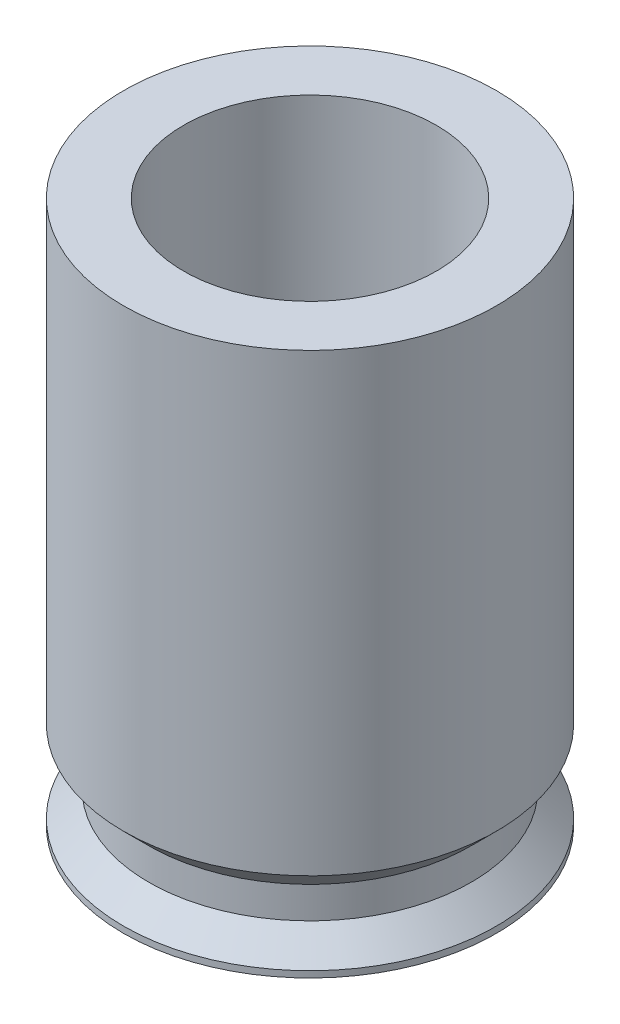
ISO-10303-21;
HEADER;
FILE_DESCRIPTION(('STEP AP214'),'2;1');
FILE_NAME('part.step','',(''),(''),'','','');
FILE_SCHEMA(('AUTOMOTIVE_DESIGN { 1 0 10303 214 1 1 1 1 }'));
ENDSEC;
DATA;
#1=APPLICATION_CONTEXT('core data for automotive mechanical design processes');
#2=APPLICATION_PROTOCOL_DEFINITION('international standard','automotive_design',2000,#1);
#3=PRODUCT_CONTEXT('',#1,'mechanical');
#4=PRODUCT('Part','Part','',(#3));
#5=PRODUCT_RELATED_PRODUCT_CATEGORY('part','',(#4));
#6=PRODUCT_DEFINITION_FORMATION('','',#4);
#7=PRODUCT_DEFINITION_CONTEXT('part definition',#1,'design');
#8=PRODUCT_DEFINITION('design','',#6,#7);
#9=PRODUCT_DEFINITION_SHAPE('','',#8);
#10=(LENGTH_UNIT() NAMED_UNIT(*) SI_UNIT(.MILLI.,.METRE.));
#11=(NAMED_UNIT(*) PLANE_ANGLE_UNIT() SI_UNIT($,.RADIAN.));
#12=(NAMED_UNIT(*) SI_UNIT($,.STERADIAN.) SOLID_ANGLE_UNIT());
#13=UNCERTAINTY_MEASURE_WITH_UNIT(LENGTH_MEASURE(1.E-05),#10,'distance_accuracy_value','');
#14=(GEOMETRIC_REPRESENTATION_CONTEXT(3) GLOBAL_UNCERTAINTY_ASSIGNED_CONTEXT((#13)) GLOBAL_UNIT_ASSIGNED_CONTEXT((#10,
#11,#12)) REPRESENTATION_CONTEXT('',''));
#15=CARTESIAN_POINT('',(0.,0.,0.));
#16=DIRECTION('',(0.,0.,1.));
#17=DIRECTION('',(1.,0.,0.));
#18=AXIS2_PLACEMENT_3D('',#15,#16,#17);
#19=CARTESIAN_POINT('',(0.,4.3,0.));
#20=DIRECTION('',(0.,-1.,0.));
#21=DIRECTION('',(0.,0.,-1.));
#22=AXIS2_PLACEMENT_3D('',#19,#20,#21);
#23=CYLINDRICAL_SURFACE('',#22,2.95);
#24=CARTESIAN_POINT('',(0.,-4.2,0.));
#25=DIRECTION('',(0.,1.,0.));
#26=DIRECTION('',(0.,0.,1.));
#27=AXIS2_PLACEMENT_3D('',#24,#25,#26);
#28=CIRCLE('',#27,2.95);
#29=CARTESIAN_POINT('',(0.,-4.2,-2.95));
#30=VERTEX_POINT('',#29);
#31=EDGE_CURVE('E40',#30,#30,#28,.F.);
#32=CARTESIAN_POINT('',(0.,-4.3,0.));
#33=DIRECTION('',(0.,1.,0.));
#34=DIRECTION('',(0.,0.,1.));
#35=AXIS2_PLACEMENT_3D('',#32,#33,#34);
#36=CIRCLE('',#35,2.95);
#37=CARTESIAN_POINT('',(0.,-4.3,-2.95));
#38=VERTEX_POINT('',#37);
#39=EDGE_CURVE('E48',#38,#38,#36,.T.);
#40=CARTESIAN_POINT('',(0.,-4.2,-2.95));
#41=CARTESIAN_POINT('',(0.,-4.20104166666667,-2.95));
#42=CARTESIAN_POINT('',(0.,-4.20208333333333,-2.95));
#43=CARTESIAN_POINT('',(0.,-4.20416666666666,-2.95));
#44=CARTESIAN_POINT('',(0.,-4.20520833333333,-2.95));
#45=CARTESIAN_POINT('',(0.,-4.20729166666667,-2.95));
#46=CARTESIAN_POINT('',(0.,-4.20833333333333,-2.95));
#47=CARTESIAN_POINT('',(0.,-4.21041666666667,-2.95));
#48=CARTESIAN_POINT('',(0.,-4.21145833333333,-2.95));
#49=CARTESIAN_POINT('',(0.,-4.21354166666667,-2.95));
#50=CARTESIAN_POINT('',(0.,-4.21458333333333,-2.95));
#51=CARTESIAN_POINT('',(0.,-4.21666666666667,-2.95));
#52=CARTESIAN_POINT('',(0.,-4.21770833333333,-2.95));
#53=CARTESIAN_POINT('',(0.,-4.21979166666667,-2.95));
#54=CARTESIAN_POINT('',(0.,-4.22083333333333,-2.95));
#55=CARTESIAN_POINT('',(0.,-4.22291666666667,-2.95));
#56=CARTESIAN_POINT('',(0.,-4.22395833333333,-2.95));
#57=CARTESIAN_POINT('',(0.,-4.22604166666667,-2.95));
#58=CARTESIAN_POINT('',(0.,-4.22708333333333,-2.95));
#59=CARTESIAN_POINT('',(0.,-4.22916666666667,-2.95));
#60=CARTESIAN_POINT('',(0.,-4.23020833333333,-2.95));
#61=CARTESIAN_POINT('',(0.,-4.23229166666667,-2.95));
#62=CARTESIAN_POINT('',(0.,-4.23333333333333,-2.95));
#63=CARTESIAN_POINT('',(0.,-4.23541666666667,-2.95));
#64=CARTESIAN_POINT('',(0.,-4.23645833333333,-2.95));
#65=CARTESIAN_POINT('',(0.,-4.23854166666667,-2.95));
#66=CARTESIAN_POINT('',(0.,-4.23958333333333,-2.95));
#67=CARTESIAN_POINT('',(0.,-4.24166666666667,-2.95));
#68=CARTESIAN_POINT('',(0.,-4.24270833333333,-2.95));
#69=CARTESIAN_POINT('',(0.,-4.24479166666667,-2.95));
#70=CARTESIAN_POINT('',(0.,-4.24583333333333,-2.95));
#71=CARTESIAN_POINT('',(0.,-4.24791666666667,-2.95));
#72=CARTESIAN_POINT('',(0.,-4.24895833333333,-2.95));
#73=CARTESIAN_POINT('',(0.,-4.25104166666667,-2.95));
#74=CARTESIAN_POINT('',(0.,-4.25208333333333,-2.95));
#75=CARTESIAN_POINT('',(0.,-4.25416666666667,-2.95));
#76=CARTESIAN_POINT('',(0.,-4.25520833333333,-2.95));
#77=CARTESIAN_POINT('',(0.,-4.25729166666667,-2.95));
#78=CARTESIAN_POINT('',(0.,-4.25833333333333,-2.95));
#79=CARTESIAN_POINT('',(0.,-4.26041666666667,-2.95));
#80=CARTESIAN_POINT('',(0.,-4.26145833333333,-2.95));
#81=CARTESIAN_POINT('',(0.,-4.26354166666667,-2.95));
#82=CARTESIAN_POINT('',(0.,-4.26458333333333,-2.95));
#83=CARTESIAN_POINT('',(0.,-4.26666666666667,-2.95));
#84=CARTESIAN_POINT('',(0.,-4.26770833333333,-2.95));
#85=CARTESIAN_POINT('',(0.,-4.26979166666667,-2.95));
#86=CARTESIAN_POINT('',(0.,-4.27083333333333,-2.95));
#87=CARTESIAN_POINT('',(0.,-4.27291666666667,-2.95));
#88=CARTESIAN_POINT('',(0.,-4.27395833333333,-2.95));
#89=CARTESIAN_POINT('',(0.,-4.27604166666667,-2.95));
#90=CARTESIAN_POINT('',(0.,-4.27708333333333,-2.95));
#91=CARTESIAN_POINT('',(0.,-4.27916666666667,-2.95));
#92=CARTESIAN_POINT('',(0.,-4.28020833333333,-2.95));
#93=CARTESIAN_POINT('',(0.,-4.28229166666667,-2.95));
#94=CARTESIAN_POINT('',(0.,-4.28333333333333,-2.95));
#95=CARTESIAN_POINT('',(0.,-4.28541666666667,-2.95));
#96=CARTESIAN_POINT('',(0.,-4.28645833333333,-2.95));
#97=CARTESIAN_POINT('',(0.,-4.28854166666667,-2.95));
#98=CARTESIAN_POINT('',(0.,-4.28958333333333,-2.95));
#99=CARTESIAN_POINT('',(0.,-4.29166666666667,-2.95));
#100=CARTESIAN_POINT('',(0.,-4.29270833333334,-2.95));
#101=CARTESIAN_POINT('',(0.,-4.29479166666667,-2.95));
#102=CARTESIAN_POINT('',(0.,-4.29583333333334,-2.95));
#103=CARTESIAN_POINT('',(0.,-4.29791666666667,-2.95));
#104=CARTESIAN_POINT('',(0.,-4.29895833333333,-2.95));
#105=CARTESIAN_POINT('',(0.,-4.3,-2.95));
#106=B_SPLINE_CURVE_WITH_KNOTS('',3,(#40,#41,#42,#43,#44,#45,#46,#47,#48,#49,#50,#51,#52,#53,
#54,#55,#56,#57,#58,#59,#60,#61,#62,#63,#64,#65,#66,#67,#68,#69,#70,#71,#72,#73,#74,#75,#76,#77,
#78,#79,#80,#81,#82,#83,#84,#85,#86,#87,#88,#89,#90,#91,#92,#93,#94,#95,#96,#97,#98,#99,#100,
#101,#102,#103,#104,#105),.UNSPECIFIED.,.F.,.F.,(4,2,2,2,2,2,2,2,2,2,2,2,2,2,2,2,2,2,2,2,2,2,2,
2,2,2,2,2,2,2,2,2,4),(0.,0.00312499999999966,0.00624999999999931,0.0093750000000007,
0.0125000000000004,0.015625,0.0187500000000014,0.0218750000000011,0.0250000000000007,
0.0281250000000004,0.03125,0.0343750000000014,0.0375000000000011,0.0406250000000007,
0.0437500000000021,0.0468750000000018,0.0500000000000014,0.0531250000000011,0.0562500000000007,
0.0593750000000021,0.0625000000000018,0.0656250000000014,0.0687500000000028,0.0718750000000025,
0.0750000000000021,0.0781250000000018,0.0812500000000015,0.0843750000000029,0.0875000000000025,
0.0906250000000022,0.0937500000000036,0.0968750000000032,0.100000000000003),.UNSPECIFIED.);
#107=EDGE_CURVE('BSEAM33',#30,#38,#106,.T.);
#108=ORIENTED_EDGE('',*,*,#31,.T.);
#109=ORIENTED_EDGE('',*,*,#39,.T.);
#110=ORIENTED_EDGE('',*,*,#107,.T.);
#111=ORIENTED_EDGE('',*,*,#107,.F.);
#112=EDGE_LOOP('',(#108,#110,#109,#111));
#113=FACE_BOUND('',#112,.T.);
#114=ADVANCED_FACE('F33',(#113),#23,.T.);
#115=CARTESIAN_POINT('',(0.,-2.89999999999997,0.));
#116=DIRECTION('',(0.,-1.,0.));
#117=DIRECTION('',(0.,0.,-1.));
#118=AXIS2_PLACEMENT_3D('',#115,#116,#117);
#119=CIRCLE('',#118,2.95);
#120=CARTESIAN_POINT('',(0.,-2.89999999999997,-2.95));
#121=VERTEX_POINT('',#120);
#122=EDGE_CURVE('E10',#121,#121,#119,.F.);
#123=CARTESIAN_POINT('',(0.,4.3,0.));
#124=DIRECTION('',(0.,1.,0.));
#125=DIRECTION('',(0.,0.,1.));
#126=AXIS2_PLACEMENT_3D('',#123,#124,#125);
#127=CIRCLE('',#126,2.95);
#128=CARTESIAN_POINT('',(0.,4.3,-2.95));
#129=VERTEX_POINT('',#128);
#130=EDGE_CURVE('E44',#129,#129,#127,.T.);
#131=CARTESIAN_POINT('',(0.,-2.89999999999997,-2.95));
#132=CARTESIAN_POINT('',(0.,-2.82499999999997,-2.95));
#133=CARTESIAN_POINT('',(0.,-2.74999999999997,-2.95));
#134=CARTESIAN_POINT('',(0.,-2.59999999999997,-2.95));
#135=CARTESIAN_POINT('',(0.,-2.52499999999997,-2.95));
#136=CARTESIAN_POINT('',(0.,-2.37499999999997,-2.95));
#137=CARTESIAN_POINT('',(0.,-2.29999999999997,-2.95));
#138=CARTESIAN_POINT('',(0.,-2.14999999999997,-2.95));
#139=CARTESIAN_POINT('',(0.,-2.07499999999997,-2.95));
#140=CARTESIAN_POINT('',(0.,-1.92499999999997,-2.95));
#141=CARTESIAN_POINT('',(0.,-1.84999999999997,-2.95));
#142=CARTESIAN_POINT('',(0.,-1.69999999999997,-2.95));
#143=CARTESIAN_POINT('',(0.,-1.62499999999997,-2.95));
#144=CARTESIAN_POINT('',(0.,-1.47499999999997,-2.95));
#145=CARTESIAN_POINT('',(0.,-1.39999999999997,-2.95));
#146=CARTESIAN_POINT('',(0.,-1.24999999999998,-2.95));
#147=CARTESIAN_POINT('',(0.,-1.17499999999998,-2.95));
#148=CARTESIAN_POINT('',(0.,-1.02499999999998,-2.95));
#149=CARTESIAN_POINT('',(0.,-0.949999999999977,-2.95));
#150=CARTESIAN_POINT('',(0.,-0.799999999999978,-2.95));
#151=CARTESIAN_POINT('',(0.,-0.724999999999978,-2.95));
#152=CARTESIAN_POINT('',(0.,-0.574999999999978,-2.95));
#153=CARTESIAN_POINT('',(0.,-0.499999999999978,-2.95));
#154=CARTESIAN_POINT('',(0.,-0.349999999999979,-2.95));
#155=CARTESIAN_POINT('',(0.,-0.274999999999979,-2.95));
#156=CARTESIAN_POINT('',(0.,-0.12499999999998,-2.95));
#157=CARTESIAN_POINT('',(0.,-0.0499999999999806,-2.95));
#158=CARTESIAN_POINT('',(0.,0.100000000000019,-2.95));
#159=CARTESIAN_POINT('',(0.,0.175000000000019,-2.95));
#160=CARTESIAN_POINT('',(0.,0.325000000000018,-2.95));
#161=CARTESIAN_POINT('',(0.,0.400000000000017,-2.95));
#162=CARTESIAN_POINT('',(0.,0.550000000000016,-2.95));
#163=CARTESIAN_POINT('',(0.,0.625000000000016,-2.95));
#164=CARTESIAN_POINT('',(0.,0.775000000000015,-2.95));
#165=CARTESIAN_POINT('',(0.,0.850000000000015,-2.95));
#166=CARTESIAN_POINT('',(0.,1.00000000000001,-2.95));
#167=CARTESIAN_POINT('',(0.,1.07500000000001,-2.95));
#168=CARTESIAN_POINT('',(0.,1.22500000000001,-2.95));
#169=CARTESIAN_POINT('',(0.,1.30000000000001,-2.95));
#170=CARTESIAN_POINT('',(0.,1.45000000000001,-2.95));
#171=CARTESIAN_POINT('',(0.,1.52500000000001,-2.95));
#172=CARTESIAN_POINT('',(0.,1.67500000000001,-2.95));
#173=CARTESIAN_POINT('',(0.,1.75000000000001,-2.95));
#174=CARTESIAN_POINT('',(0.,1.90000000000001,-2.95));
#175=CARTESIAN_POINT('',(0.,1.97500000000001,-2.95));
#176=CARTESIAN_POINT('',(0.,2.12500000000001,-2.95));
#177=CARTESIAN_POINT('',(0.,2.20000000000001,-2.95));
#178=CARTESIAN_POINT('',(0.,2.35000000000001,-2.95));
#179=CARTESIAN_POINT('',(0.,2.42500000000001,-2.95));
#180=CARTESIAN_POINT('',(0.,2.57500000000001,-2.95));
#181=CARTESIAN_POINT('',(0.,2.65000000000001,-2.95));
#182=CARTESIAN_POINT('',(0.,2.80000000000001,-2.95));
#183=CARTESIAN_POINT('',(0.,2.87500000000001,-2.95));
#184=CARTESIAN_POINT('',(0.,3.02500000000001,-2.95));
#185=CARTESIAN_POINT('',(0.,3.1,-2.95));
#186=CARTESIAN_POINT('',(0.,3.25,-2.95));
#187=CARTESIAN_POINT('',(0.,3.325,-2.95));
#188=CARTESIAN_POINT('',(0.,3.475,-2.95));
#189=CARTESIAN_POINT('',(0.,3.55,-2.95));
#190=CARTESIAN_POINT('',(0.,3.7,-2.95));
#191=CARTESIAN_POINT('',(0.,3.775,-2.95));
#192=CARTESIAN_POINT('',(0.,3.925,-2.95));
#193=CARTESIAN_POINT('',(0.,4.,-2.95));
#194=CARTESIAN_POINT('',(0.,4.15,-2.95));
#195=CARTESIAN_POINT('',(0.,4.225,-2.95));
#196=CARTESIAN_POINT('',(0.,4.3,-2.95));
#197=B_SPLINE_CURVE_WITH_KNOTS('',3,(#131,#132,#133,#134,#135,#136,#137,#138,#139,#140,#141,
#142,#143,#144,#145,#146,#147,#148,#149,#150,#151,#152,#153,#154,#155,#156,#157,#158,#159,#160,
#161,#162,#163,#164,#165,#166,#167,#168,#169,#170,#171,#172,#173,#174,#175,#176,#177,#178,#179,
#180,#181,#182,#183,#184,#185,#186,#187,#188,#189,#190,#191,#192,#193,#194,#195,#196),
.UNSPECIFIED.,.F.,.F.,(4,2,2,2,2,2,2,2,2,2,2,2,2,2,2,2,2,2,2,2,2,2,2,2,2,2,2,2,2,2,2,2,4),(0.,
0.224999999999999,0.449999999999998,0.674999999999997,0.899999999999996,1.12499999999999,
1.34999999999999,1.57499999999999,1.79999999999999,2.02499999999999,2.24999999999999,
2.47499999999999,2.69999999999999,2.92499999999999,3.14999999999999,3.37499999999998,
3.59999999999998,3.82499999999998,4.04999999999998,4.27499999999998,4.49999999999998,
4.72499999999998,4.94999999999998,5.17499999999998,5.39999999999997,5.62499999999997,
5.84999999999997,6.07499999999997,6.29999999999997,6.52499999999997,6.74999999999997,
6.97499999999997,7.19999999999997),.UNSPECIFIED.);
#198=EDGE_CURVE('BSEAM77',#121,#129,#197,.T.);
#199=ORIENTED_EDGE('',*,*,#122,.T.);
#200=ORIENTED_EDGE('',*,*,#130,.F.);
#201=ORIENTED_EDGE('',*,*,#198,.T.);
#202=ORIENTED_EDGE('',*,*,#198,.F.);
#203=EDGE_LOOP('',(#199,#201,#200,#202));
#204=FACE_BOUND('',#203,.T.);
#205=ADVANCED_FACE('F77',(#204),#23,.T.);
#206=CARTESIAN_POINT('',(0.,4.3,0.));
#207=DIRECTION('',(0.,1.,0.));
#208=DIRECTION('',(0.,0.,1.));
#209=AXIS2_PLACEMENT_3D('',#206,#207,#208);
#210=PLANE('',#209);
#211=ORIENTED_EDGE('',*,*,#130,.T.);
#212=EDGE_LOOP('',(#211));
#213=FACE_BOUND('',#212,.T.);
#214=CARTESIAN_POINT('',(0.,4.3,0.));
#215=DIRECTION('',(0.,1.,0.));
#216=DIRECTION('',(0.,0.,1.));
#217=AXIS2_PLACEMENT_3D('',#214,#215,#216);
#218=CIRCLE('',#217,2.);
#219=CARTESIAN_POINT('',(0.,4.3,-2.));
#220=VERTEX_POINT('',#219);
#221=EDGE_CURVE('E52',#220,#220,#218,.T.);
#222=ORIENTED_EDGE('',*,*,#221,.F.);
#223=EDGE_LOOP('',(#222));
#224=FACE_BOUND('',#223,.T.);
#225=ADVANCED_FACE('F82',(#213,#224),#210,.T.);
#226=CARTESIAN_POINT('',(0.,-4.3,0.));
#227=DIRECTION('',(0.,1.,0.));
#228=DIRECTION('',(0.,0.,1.));
#229=AXIS2_PLACEMENT_3D('',#226,#227,#228);
#230=PLANE('',#229);
#231=ORIENTED_EDGE('',*,*,#39,.F.);
#232=EDGE_LOOP('',(#231));
#233=FACE_BOUND('',#232,.T.);
#234=CARTESIAN_POINT('',(0.,-4.3,0.));
#235=DIRECTION('',(0.,1.,0.));
#236=DIRECTION('',(0.,0.,1.));
#237=AXIS2_PLACEMENT_3D('',#234,#235,#236);
#238=CIRCLE('',#237,2.);
#239=CARTESIAN_POINT('',(0.,-4.3,-2.));
#240=VERTEX_POINT('',#239);
#241=EDGE_CURVE('E54',#240,#240,#238,.T.);
#242=ORIENTED_EDGE('',*,*,#241,.T.);
#243=EDGE_LOOP('',(#242));
#244=FACE_BOUND('',#243,.T.);
#245=ADVANCED_FACE('F85',(#233,#244),#230,.F.);
#246=CARTESIAN_POINT('',(0.,4.3,0.));
#247=DIRECTION('',(0.,-1.,0.));
#248=DIRECTION('',(0.,0.,-1.));
#249=AXIS2_PLACEMENT_3D('',#246,#247,#248);
#250=CYLINDRICAL_SURFACE('',#249,2.);
#251=CARTESIAN_POINT('',(0.,4.3,-2.));
#252=CARTESIAN_POINT('',(0.,4.21041666666667,-2.));
#253=CARTESIAN_POINT('',(0.,4.12083333333333,-2.));
#254=CARTESIAN_POINT('',(0.,3.94166666666667,-2.));
#255=CARTESIAN_POINT('',(0.,3.85208333333333,-2.));
#256=CARTESIAN_POINT('',(0.,3.67291666666667,-2.));
#257=CARTESIAN_POINT('',(0.,3.58333333333333,-2.));
#258=CARTESIAN_POINT('',(0.,3.40416666666667,-2.));
#259=CARTESIAN_POINT('',(0.,3.31458333333333,-2.));
#260=CARTESIAN_POINT('',(0.,3.13541666666667,-2.));
#261=CARTESIAN_POINT('',(0.,3.04583333333333,-2.));
#262=CARTESIAN_POINT('',(0.,2.86666666666667,-2.));
#263=CARTESIAN_POINT('',(0.,2.77708333333333,-2.));
#264=CARTESIAN_POINT('',(0.,2.59791666666667,-2.));
#265=CARTESIAN_POINT('',(0.,2.50833333333333,-2.));
#266=CARTESIAN_POINT('',(0.,2.32916666666667,-2.));
#267=CARTESIAN_POINT('',(0.,2.23958333333333,-2.));
#268=CARTESIAN_POINT('',(0.,2.06041666666667,-2.));
#269=CARTESIAN_POINT('',(0.,1.97083333333333,-2.));
#270=CARTESIAN_POINT('',(0.,1.79166666666667,-2.));
#271=CARTESIAN_POINT('',(0.,1.70208333333333,-2.));
#272=CARTESIAN_POINT('',(0.,1.52291666666667,-2.));
#273=CARTESIAN_POINT('',(0.,1.43333333333333,-2.));
#274=CARTESIAN_POINT('',(0.,1.25416666666667,-2.));
#275=CARTESIAN_POINT('',(0.,1.16458333333333,-2.));
#276=CARTESIAN_POINT('',(0.,0.985416666666665,-2.));
#277=CARTESIAN_POINT('',(0.,0.895833333333332,-2.));
#278=CARTESIAN_POINT('',(0.,0.716666666666665,-2.));
#279=CARTESIAN_POINT('',(0.,0.627083333333332,-2.));
#280=CARTESIAN_POINT('',(0.,0.447916666666665,-2.));
#281=CARTESIAN_POINT('',(0.,0.358333333333332,-2.));
#282=CARTESIAN_POINT('',(0.,0.179166666666666,-2.));
#283=CARTESIAN_POINT('',(0.,0.0895833333333324,-2.));
#284=CARTESIAN_POINT('',(0.,-0.0895833333333342,-2.));
#285=CARTESIAN_POINT('',(0.,-0.179166666666667,-2.));
#286=CARTESIAN_POINT('',(0.,-0.358333333333334,-2.));
#287=CARTESIAN_POINT('',(0.,-0.447916666666667,-2.));
#288=CARTESIAN_POINT('',(0.,-0.627083333333334,-2.));
#289=CARTESIAN_POINT('',(0.,-0.716666666666668,-2.));
#290=CARTESIAN_POINT('',(0.,-0.895833333333335,-2.));
#291=CARTESIAN_POINT('',(0.,-0.985416666666668,-2.));
#292=CARTESIAN_POINT('',(0.,-1.16458333333333,-2.));
#293=CARTESIAN_POINT('',(0.,-1.25416666666667,-2.));
#294=CARTESIAN_POINT('',(0.,-1.43333333333333,-2.));
#295=CARTESIAN_POINT('',(0.,-1.52291666666667,-2.));
#296=CARTESIAN_POINT('',(0.,-1.70208333333334,-2.));
#297=CARTESIAN_POINT('',(0.,-1.79166666666667,-2.));
#298=CARTESIAN_POINT('',(0.,-1.97083333333334,-2.));
#299=CARTESIAN_POINT('',(0.,-2.06041666666667,-2.));
#300=CARTESIAN_POINT('',(0.,-2.23958333333334,-2.));
#301=CARTESIAN_POINT('',(0.,-2.32916666666667,-2.));
#302=CARTESIAN_POINT('',(0.,-2.50833333333334,-2.));
#303=CARTESIAN_POINT('',(0.,-2.59791666666667,-2.));
#304=CARTESIAN_POINT('',(0.,-2.77708333333333,-2.));
#305=CARTESIAN_POINT('',(0.,-2.86666666666667,-2.));
#306=CARTESIAN_POINT('',(0.,-3.04583333333334,-2.));
#307=CARTESIAN_POINT('',(0.,-3.13541666666667,-2.));
#308=CARTESIAN_POINT('',(0.,-3.31458333333334,-2.));
#309=CARTESIAN_POINT('',(0.,-3.40416666666667,-2.));
#310=CARTESIAN_POINT('',(0.,-3.58333333333334,-2.));
#311=CARTESIAN_POINT('',(0.,-3.67291666666667,-2.));
#312=CARTESIAN_POINT('',(0.,-3.85208333333334,-2.));
#313=CARTESIAN_POINT('',(0.,-3.94166666666667,-2.));
#314=CARTESIAN_POINT('',(0.,-4.12083333333333,-2.));
#315=CARTESIAN_POINT('',(0.,-4.21041666666667,-2.));
#316=CARTESIAN_POINT('',(0.,-4.3,-2.));
#317=B_SPLINE_CURVE_WITH_KNOTS('',3,(#251,#252,#253,#254,#255,#256,#257,#258,#259,#260,#261,
#262,#263,#264,#265,#266,#267,#268,#269,#270,#271,#272,#273,#274,#275,#276,#277,#278,#279,#280,
#281,#282,#283,#284,#285,#286,#287,#288,#289,#290,#291,#292,#293,#294,#295,#296,#297,#298,#299,
#300,#301,#302,#303,#304,#305,#306,#307,#308,#309,#310,#311,#312,#313,#314,#315,#316),
.UNSPECIFIED.,.F.,.F.,(4,2,2,2,2,2,2,2,2,2,2,2,2,2,2,2,2,2,2,2,2,2,2,2,2,2,2,2,2,2,2,2,4),(0.,
0.268750000000001,0.537500000000001,0.806250000000001,1.075,1.34375,1.6125,1.88125,2.15,2.41875,
2.6875,2.95625,3.225,3.49375,3.7625,4.03125,4.3,4.56875,4.8375,5.10625,5.375,5.64375,5.9125,
6.18125,6.45,6.71875,6.9875,7.25625,7.525,7.79375,8.0625,8.33125,8.6),.UNSPECIFIED.);
#318=EDGE_CURVE('BSEAM88',#220,#240,#317,.T.);
#319=ORIENTED_EDGE('',*,*,#221,.T.);
#320=ORIENTED_EDGE('',*,*,#241,.F.);
#321=ORIENTED_EDGE('',*,*,#318,.T.);
#322=ORIENTED_EDGE('',*,*,#318,.F.);
#323=EDGE_LOOP('',(#319,#321,#320,#322));
#324=FACE_BOUND('',#323,.T.);
#325=ADVANCED_FACE('F88',(#324),#250,.F.);
#326=CARTESIAN_POINT('',(0.,-1000.,-3.49148133884313E-12));
#327=DIRECTION('',(0.,-1.,0.));
#328=DIRECTION('',(0.,0.,-1.));
#329=AXIS2_PLACEMENT_3D('',#326,#327,#328);
#330=CYLINDRICAL_SURFACE('',#329,2.55000000000001);
#331=CARTESIAN_POINT('',(0.,-3.29999999999997,0.));
#332=DIRECTION('',(0.,-1.,0.));
#333=DIRECTION('',(0.,0.,-1.));
#334=AXIS2_PLACEMENT_3D('',#331,#332,#333);
#335=CIRCLE('',#334,2.55000000000001);
#336=CARTESIAN_POINT('',(0.,-3.29999999999996,-2.55000000000002));
#337=VERTEX_POINT('',#336);
#338=EDGE_CURVE('E62',#337,#337,#335,.T.);
#339=ORIENTED_EDGE('',*,*,#338,.T.);
#340=EDGE_LOOP('',(#339));
#341=FACE_BOUND('',#340,.T.);
#342=CARTESIAN_POINT('',(0.,-3.80000000000003,0.));
#343=DIRECTION('',(0.,-1.,0.));
#344=DIRECTION('',(0.,0.,-1.));
#345=AXIS2_PLACEMENT_3D('',#342,#343,#344);
#346=CIRCLE('',#345,2.55000000000001);
#347=CARTESIAN_POINT('',(0.,-3.80000000000002,-2.55000000000003));
#348=VERTEX_POINT('',#347);
#349=EDGE_CURVE('E57',#348,#348,#346,.T.);
#350=ORIENTED_EDGE('',*,*,#349,.F.);
#351=EDGE_LOOP('',(#350));
#352=FACE_BOUND('',#351,.T.);
#353=ADVANCED_FACE('F66',(#341,#352),#330,.T.);
#354=CARTESIAN_POINT('',(0.,-4.2,0.));
#355=DIRECTION('',(0.,-1.,0.));
#356=DIRECTION('',(0.,0.,-1.));
#357=AXIS2_PLACEMENT_3D('',#354,#355,#356);
#358=CONICAL_SURFACE('',#357,2.95,0.785398163397451);
#359=ORIENTED_EDGE('',*,*,#349,.T.);
#360=EDGE_LOOP('',(#359));
#361=FACE_BOUND('',#360,.T.);
#362=ORIENTED_EDGE('',*,*,#31,.F.);
#363=EDGE_LOOP('',(#362));
#364=FACE_BOUND('',#363,.T.);
#365=ADVANCED_FACE('F70',(#361,#364),#358,.T.);
#366=CARTESIAN_POINT('',(0.,-3.29999999999999,0.));
#367=DIRECTION('',(0.,1.,0.));
#368=DIRECTION('',(0.,0.,1.));
#369=AXIS2_PLACEMENT_3D('',#366,#367,#368);
#370=CONICAL_SURFACE('',#369,2.54999999999998,0.785398163397446);
#371=ORIENTED_EDGE('',*,*,#122,.F.);
#372=EDGE_LOOP('',(#371));
#373=FACE_BOUND('',#372,.T.);
#374=ORIENTED_EDGE('',*,*,#338,.F.);
#375=EDGE_LOOP('',(#374));
#376=FACE_BOUND('',#375,.T.);
#377=ADVANCED_FACE('F35',(#373,#376),#370,.T.);
#378=CLOSED_SHELL('',(#114,#205,#225,#245,#325,#353,#365,#377));
#379=MANIFOLD_SOLID_BREP('B2',#378);
#380=ADVANCED_BREP_SHAPE_REPRESENTATION('',(#18,#379),#14);
#381=SHAPE_DEFINITION_REPRESENTATION(#9,#380);
ENDSEC;
END-ISO-10303-21;
